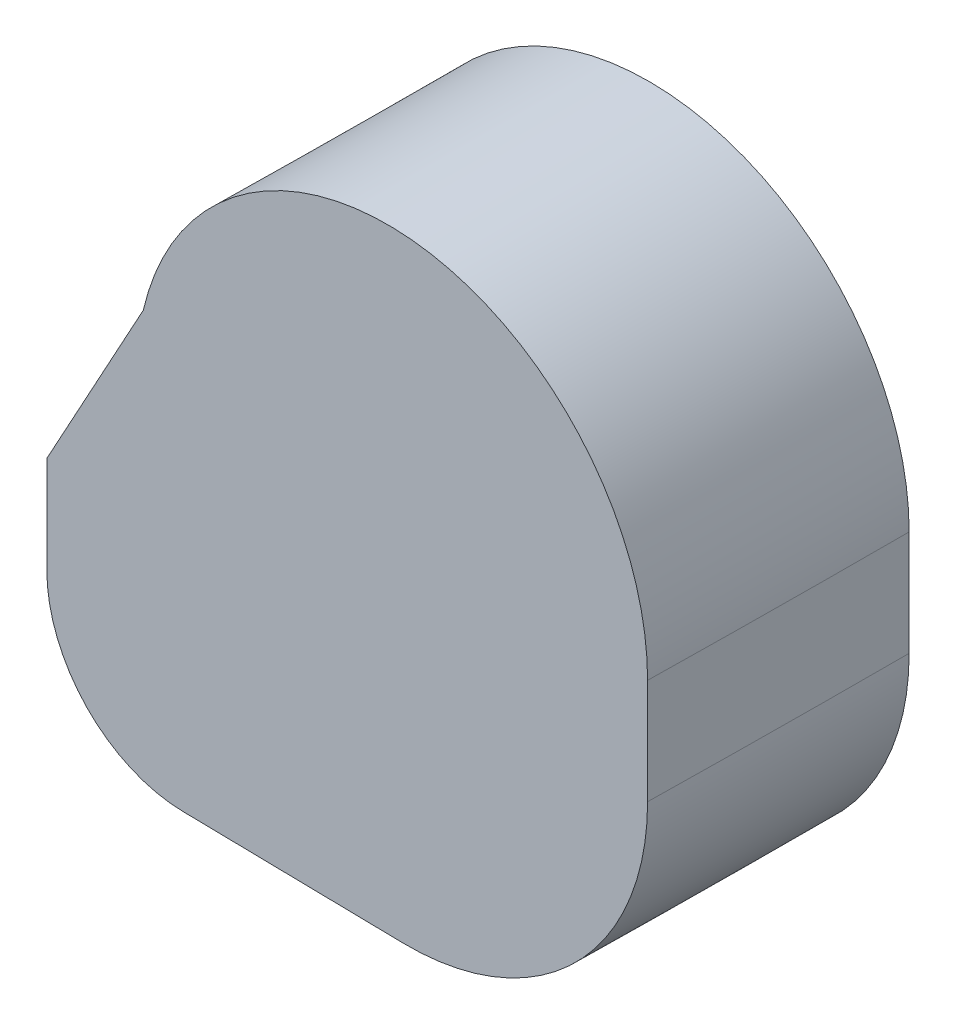
ISO-10303-21;
HEADER;
FILE_DESCRIPTION(('STEP AP214'),'2;1');
FILE_NAME('part.step','',(''),(''),'','','');
FILE_SCHEMA(('AUTOMOTIVE_DESIGN { 1 0 10303 214 1 1 1 1 }'));
ENDSEC;
DATA;
#1=APPLICATION_CONTEXT('core data for automotive mechanical design processes');
#2=APPLICATION_PROTOCOL_DEFINITION('international standard','automotive_design',2000,#1);
#3=PRODUCT_CONTEXT('',#1,'mechanical');
#4=PRODUCT('Part','Part','',(#3));
#5=PRODUCT_RELATED_PRODUCT_CATEGORY('part','',(#4));
#6=PRODUCT_DEFINITION_FORMATION('','',#4);
#7=PRODUCT_DEFINITION_CONTEXT('part definition',#1,'design');
#8=PRODUCT_DEFINITION('design','',#6,#7);
#9=PRODUCT_DEFINITION_SHAPE('','',#8);
#10=(LENGTH_UNIT() NAMED_UNIT(*) SI_UNIT(.MILLI.,.METRE.));
#11=(NAMED_UNIT(*) PLANE_ANGLE_UNIT() SI_UNIT($,.RADIAN.));
#12=(NAMED_UNIT(*) SI_UNIT($,.STERADIAN.) SOLID_ANGLE_UNIT());
#13=UNCERTAINTY_MEASURE_WITH_UNIT(LENGTH_MEASURE(1.E-05),#10,'distance_accuracy_value','');
#14=(GEOMETRIC_REPRESENTATION_CONTEXT(3) GLOBAL_UNCERTAINTY_ASSIGNED_CONTEXT((#13)) GLOBAL_UNIT_ASSIGNED_CONTEXT((#10,
#11,#12)) REPRESENTATION_CONTEXT('',''));
#15=CARTESIAN_POINT('',(0.,0.,0.));
#16=DIRECTION('',(0.,0.,1.));
#17=DIRECTION('',(1.,0.,0.));
#18=AXIS2_PLACEMENT_3D('',#15,#16,#17);
#19=CARTESIAN_POINT('',(-132.03841004,1.27,0.));
#20=DIRECTION('',(0.,1.,0.));
#21=DIRECTION('',(0.,0.,1.));
#22=AXIS2_PLACEMENT_3D('',#19,#20,#21);
#23=TOROIDAL_SURFACE('',#22,132.03841004,1.27);
#24=CARTESIAN_POINT('',(-132.03841004,1.27,0.));
#25=DIRECTION('',(0.,1.,0.));
#26=DIRECTION('',(0.,0.,1.));
#27=AXIS2_PLACEMENT_3D('',#24,#25,#26);
#28=CIRCLE('',#27,130.76841004);
#29=CARTESIAN_POINT('',(-1.2899166622401,1.27,2.28222344117543));
#30=VERTEX_POINT('',#29);
#31=CARTESIAN_POINT('',(-1.27,1.27,0.));
#32=VERTEX_POINT('',#31);
#33=EDGE_CURVE('E11',#30,#32,#28,.T.);
#34=ORIENTED_EDGE('',*,*,#33,.T.);
#35=CARTESIAN_POINT('',(0.,1.27,0.));
#36=DIRECTION('',(0.,0.,1.));
#37=DIRECTION('',(-1.,0.,0.));
#38=AXIS2_PLACEMENT_3D('',#35,#36,#37);
#39=CIRCLE('',#38,1.27);
#40=CARTESIAN_POINT('',(0.,0.,0.));
#41=VERTEX_POINT('',#40);
#42=EDGE_CURVE('E115',#32,#41,#39,.T.);
#43=ORIENTED_EDGE('',*,*,#42,.T.);
#44=CARTESIAN_POINT('',(-132.03841004,0.,0.));
#45=DIRECTION('',(0.,1.,0.));
#46=DIRECTION('',(0.,0.,1.));
#47=AXIS2_PLACEMENT_3D('',#44,#45,#46);
#48=CIRCLE('',#47,132.03841004);
#49=CARTESIAN_POINT('',(-0.0201100893914876,0.,2.30438799735078));
#50=VERTEX_POINT('',#49);
#51=EDGE_CURVE('E97',#50,#41,#48,.T.);
#52=ORIENTED_EDGE('',*,*,#51,.F.);
#53=CARTESIAN_POINT('',(-0.0201100893914876,1.27,2.30438799735078));
#54=DIRECTION('',(-0.0174524064372835,0.,0.999847695156391));
#55=DIRECTION('',(-0.999847695156391,0.,-0.0174524064372835));
#56=AXIS2_PLACEMENT_3D('',#53,#54,#55);
#57=CIRCLE('',#56,1.27);
#58=EDGE_CURVE('E133',#30,#50,#57,.T.);
#59=ORIENTED_EDGE('',*,*,#58,.F.);
#60=EDGE_LOOP('',(#34,#43,#52,#59));
#61=FACE_BOUND('',#60,.T.);
#62=ADVANCED_FACE('F39',(#61),#23,.T.);
#63=CARTESIAN_POINT('',(-132.03841004,8.38450091127262,0.));
#64=DIRECTION('',(0.,1.,0.));
#65=DIRECTION('',(0.,0.,1.));
#66=AXIS2_PLACEMENT_3D('',#63,#64,#65);
#67=CYLINDRICAL_SURFACE('',#66,130.76841004);
#68=CARTESIAN_POINT('',(-132.03841004,2.160242822,0.));
#69=DIRECTION('',(0.,1.,0.));
#70=DIRECTION('',(0.,0.,1.));
#71=AXIS2_PLACEMENT_3D('',#68,#69,#70);
#72=CIRCLE('',#71,130.76841004);
#73=CARTESIAN_POINT('',(-1.2899166622401,2.160242822,2.28222344117543));
#74=VERTEX_POINT('',#73);
#75=CARTESIAN_POINT('',(-1.27,2.160242822,0.));
#76=VERTEX_POINT('',#75);
#77=EDGE_CURVE('E47',#74,#76,#72,.T.);
#78=ORIENTED_EDGE('',*,*,#77,.T.);
#79=DIRECTION('',(0.,-1.,0.));
#80=VECTOR('',#79,1.);
#81=CARTESIAN_POINT('',(-1.27,1.27,0.));
#82=LINE('',#81,#80);
#83=EDGE_CURVE('E131',#76,#32,#82,.T.);
#84=ORIENTED_EDGE('',*,*,#83,.T.);
#85=ORIENTED_EDGE('',*,*,#33,.F.);
#86=DIRECTION('',(0.,-1.,0.));
#87=VECTOR('',#86,1.);
#88=CARTESIAN_POINT('',(-1.2899166622401,1.27,2.28222344117543));
#89=LINE('',#88,#87);
#90=EDGE_CURVE('E109',#74,#30,#89,.T.);
#91=ORIENTED_EDGE('',*,*,#90,.F.);
#92=EDGE_LOOP('',(#78,#84,#85,#91));
#93=FACE_BOUND('',#92,.T.);
#94=ADVANCED_FACE('F41',(#93),#67,.F.);
#95=CARTESIAN_POINT('',(-132.03841004,3.79599359689122,0.));
#96=DIRECTION('',(0.,1.,0.));
#97=DIRECTION('',(0.,0.,1.));
#98=AXIS2_PLACEMENT_3D('',#95,#96,#97);
#99=CONICAL_SURFACE('',#98,131.669595298417,0.50355745042433);
#100=CARTESIAN_POINT('',(-132.03841004,3.79599359689122,0.));
#101=DIRECTION('',(0.,1.,0.));
#102=DIRECTION('',(0.,0.,1.));
#103=AXIS2_PLACEMENT_3D('',#100,#101,#102);
#104=CIRCLE('',#103,131.669595298417);
#105=CARTESIAN_POINT('',(-0.388868658703236,3.79599359689122,2.29795129258061));
#106=VERTEX_POINT('',#105);
#107=CARTESIAN_POINT('',(-0.368814741583286,3.79599359689122,0.));
#108=VERTEX_POINT('',#107);
#109=EDGE_CURVE('E153',#106,#108,#104,.T.);
#110=ORIENTED_EDGE('',*,*,#109,.T.);
#111=DIRECTION('',(-0.48254445480582,-0.875871479805202,0.));
#112=VECTOR('',#111,1.);
#113=CARTESIAN_POINT('',(-0.368814741583286,3.79599359689122,0.));
#114=LINE('',#113,#112);
#115=EDGE_CURVE('E129',#108,#76,#114,.T.);
#116=ORIENTED_EDGE('',*,*,#115,.T.);
#117=ORIENTED_EDGE('',*,*,#77,.F.);
#118=DIRECTION('',(-0.482470960948096,-0.875871479805202,-0.00842156194932857));
#119=VECTOR('',#118,1.);
#120=CARTESIAN_POINT('',(-0.388868658703237,3.79599359689122,2.29795129258061));
#121=LINE('',#120,#119);
#122=EDGE_CURVE('E145',#106,#74,#121,.T.);
#123=ORIENTED_EDGE('',*,*,#122,.F.);
#124=EDGE_LOOP('',(#110,#116,#117,#123));
#125=FACE_BOUND('',#124,.T.);
#126=ADVANCED_FACE('F155',(#125),#99,.F.);
#127=CARTESIAN_POINT('',(-132.03841004,3.2512,0.));
#128=DIRECTION('',(0.,1.,0.));
#129=DIRECTION('',(0.,0.,1.));
#130=AXIS2_PLACEMENT_3D('',#127,#128,#129);
#131=TOROIDAL_SURFACE('',#130,133.99421004,2.3876);
#132=CARTESIAN_POINT('',(-132.03841004,3.2512,0.));
#133=DIRECTION('',(0.,1.,0.));
#134=DIRECTION('',(0.,0.,1.));
#135=AXIS2_PLACEMENT_3D('',#132,#133,#134);
#136=CIRCLE('',#135,136.38181004);
#137=CARTESIAN_POINT('',(4.32262838975078,3.2512,2.38019077947048));
#138=VERTEX_POINT('',#137);
#139=CARTESIAN_POINT('',(4.3434,3.2512,0.));
#140=VERTEX_POINT('',#139);
#141=EDGE_CURVE('E151',#138,#140,#136,.T.);
#142=ORIENTED_EDGE('',*,*,#141,.T.);
#143=CARTESIAN_POINT('',(1.9558,3.2512,0.));
#144=DIRECTION('',(0.,0.,1.));
#145=DIRECTION('',(1.,0.,0.));
#146=AXIS2_PLACEMENT_3D('',#143,#144,#145);
#147=CIRCLE('',#146,2.3876);
#148=EDGE_CURVE('E126',#140,#108,#147,.T.);
#149=ORIENTED_EDGE('',*,*,#148,.T.);
#150=ORIENTED_EDGE('',*,*,#109,.F.);
#151=CARTESIAN_POINT('',(1.93539203279538,3.2512,2.33852141386082));
#152=DIRECTION('',(-0.0174524064372835,0.,0.999847695156391));
#153=DIRECTION('',(0.999847695156391,0.,0.0174524064372835));
#154=AXIS2_PLACEMENT_3D('',#151,#152,#153);
#155=CIRCLE('',#154,2.3876);
#156=EDGE_CURVE('E142',#138,#106,#155,.T.);
#157=ORIENTED_EDGE('',*,*,#156,.F.);
#158=EDGE_LOOP('',(#142,#149,#150,#157));
#159=FACE_BOUND('',#158,.T.);
#160=ADVANCED_FACE('F158',(#159),#131,.T.);
#161=CARTESIAN_POINT('',(-132.03841004,8.38450091127262,0.));
#162=DIRECTION('',(0.,1.,0.));
#163=DIRECTION('',(0.,0.,1.));
#164=AXIS2_PLACEMENT_3D('',#161,#162,#163);
#165=CYLINDRICAL_SURFACE('',#164,136.38181004);
#166=CARTESIAN_POINT('',(-132.03841004,2.28600000000001,0.));
#167=DIRECTION('',(0.,1.,0.));
#168=DIRECTION('',(0.,0.,1.));
#169=AXIS2_PLACEMENT_3D('',#166,#167,#168);
#170=CIRCLE('',#169,136.38181004);
#171=CARTESIAN_POINT('',(4.32262838975078,2.28600000000001,2.38019077947048));
#172=VERTEX_POINT('',#171);
#173=CARTESIAN_POINT('',(4.3434,2.28600000000001,0.));
#174=VERTEX_POINT('',#173);
#175=EDGE_CURVE('E149',#172,#174,#170,.T.);
#176=ORIENTED_EDGE('',*,*,#175,.T.);
#177=DIRECTION('',(0.,1.,0.));
#178=VECTOR('',#177,1.);
#179=CARTESIAN_POINT('',(4.3434,2.28600000000001,0.));
#180=LINE('',#179,#178);
#181=EDGE_CURVE('E123',#174,#140,#180,.T.);
#182=ORIENTED_EDGE('',*,*,#181,.T.);
#183=ORIENTED_EDGE('',*,*,#141,.F.);
#184=DIRECTION('',(0.,1.,0.));
#185=VECTOR('',#184,1.);
#186=CARTESIAN_POINT('',(4.32262838975078,2.28600000000001,2.38019077947048));
#187=LINE('',#186,#185);
#188=EDGE_CURVE('E139',#172,#138,#187,.T.);
#189=ORIENTED_EDGE('',*,*,#188,.F.);
#190=EDGE_LOOP('',(#176,#182,#183,#189));
#191=FACE_BOUND('',#190,.T.);
#192=ADVANCED_FACE('F162',(#191),#165,.T.);
#193=CARTESIAN_POINT('',(-132.03841004,2.286,0.));
#194=DIRECTION('',(0.,1.,0.));
#195=DIRECTION('',(0.,0.,1.));
#196=AXIS2_PLACEMENT_3D('',#193,#194,#195);
#197=TOROIDAL_SURFACE('',#196,134.09581004,2.286);
#198=CARTESIAN_POINT('',(-132.03841004,0.,0.));
#199=DIRECTION('',(0.,1.,0.));
#200=DIRECTION('',(0.,0.,1.));
#201=AXIS2_PLACEMENT_3D('',#198,#199,#200);
#202=CIRCLE('',#201,134.09581004);
#203=CARTESIAN_POINT('',(2.03697655862327,0.,2.34029457835485));
#204=VERTEX_POINT('',#203);
#205=CARTESIAN_POINT('',(2.0574,0.,0.));
#206=VERTEX_POINT('',#205);
#207=EDGE_CURVE('E108',#204,#206,#202,.T.);
#208=ORIENTED_EDGE('',*,*,#207,.T.);
#209=CARTESIAN_POINT('',(2.0574,2.286,0.));
#210=DIRECTION('',(0.,0.,1.));
#211=DIRECTION('',(1.,0.,0.));
#212=AXIS2_PLACEMENT_3D('',#209,#210,#211);
#213=CIRCLE('',#212,2.286);
#214=EDGE_CURVE('E118',#206,#174,#213,.T.);
#215=ORIENTED_EDGE('',*,*,#214,.T.);
#216=ORIENTED_EDGE('',*,*,#175,.F.);
#217=CARTESIAN_POINT('',(2.03697655862327,2.286,2.34029457835485));
#218=DIRECTION('',(-0.0174524064372835,0.,0.999847695156391));
#219=DIRECTION('',(0.999847695156391,0.,0.0174524064372835));
#220=AXIS2_PLACEMENT_3D('',#217,#218,#219);
#221=CIRCLE('',#220,2.286);
#222=EDGE_CURVE('E136',#204,#172,#221,.T.);
#223=ORIENTED_EDGE('',*,*,#222,.F.);
#224=EDGE_LOOP('',(#208,#215,#216,#223));
#225=FACE_BOUND('',#224,.T.);
#226=ADVANCED_FACE('F165',(#225),#197,.T.);
#227=CARTESIAN_POINT('',(-0.0201100893914876,0.,2.30438799735078));
#228=DIRECTION('',(0.,1.,0.));
#229=DIRECTION('',(0.,0.,1.));
#230=AXIS2_PLACEMENT_3D('',#227,#228,#229);
#231=PLANE('',#230);
#232=DIRECTION('',(0.999847695156391,0.,0.0174524064372835));
#233=VECTOR('',#232,1.);
#234=CARTESIAN_POINT('',(-0.0201100893914876,0.,2.30438799735078));
#235=LINE('',#234,#233);
#236=EDGE_CURVE('E103',#50,#204,#235,.T.);
#237=ORIENTED_EDGE('',*,*,#236,.F.);
#238=ORIENTED_EDGE('',*,*,#51,.T.);
#239=DIRECTION('',(1.,0.,0.));
#240=VECTOR('',#239,1.);
#241=CARTESIAN_POINT('',(0.,0.,0.));
#242=LINE('',#241,#240);
#243=EDGE_CURVE('E100',#41,#206,#242,.T.);
#244=ORIENTED_EDGE('',*,*,#243,.T.);
#245=ORIENTED_EDGE('',*,*,#207,.F.);
#246=EDGE_LOOP('',(#237,#238,#244,#245));
#247=FACE_BOUND('',#246,.T.);
#248=ADVANCED_FACE('F99',(#247),#231,.F.);
#249=CARTESIAN_POINT('',(-0.0201100893914876,1.27,2.30438799735078));
#250=DIRECTION('',(0.0174524064372835,0.,-0.999847695156391));
#251=DIRECTION('',(-0.999847695156391,0.,-0.0174524064372835));
#252=AXIS2_PLACEMENT_3D('',#249,#250,#251);
#253=PLANE('',#252);
#254=ORIENTED_EDGE('',*,*,#58,.T.);
#255=ORIENTED_EDGE('',*,*,#236,.T.);
#256=ORIENTED_EDGE('',*,*,#222,.T.);
#257=ORIENTED_EDGE('',*,*,#188,.T.);
#258=ORIENTED_EDGE('',*,*,#156,.T.);
#259=ORIENTED_EDGE('',*,*,#122,.T.);
#260=ORIENTED_EDGE('',*,*,#90,.T.);
#261=EDGE_LOOP('',(#254,#255,#256,#257,#258,#259,#260));
#262=FACE_BOUND('',#261,.T.);
#263=ADVANCED_FACE('F167',(#262),#253,.F.);
#264=CARTESIAN_POINT('',(0.,1.27,0.));
#265=DIRECTION('',(0.,0.,-1.));
#266=DIRECTION('',(-1.,0.,0.));
#267=AXIS2_PLACEMENT_3D('',#264,#265,#266);
#268=PLANE('',#267);
#269=ORIENTED_EDGE('',*,*,#42,.F.);
#270=ORIENTED_EDGE('',*,*,#83,.F.);
#271=ORIENTED_EDGE('',*,*,#115,.F.);
#272=ORIENTED_EDGE('',*,*,#148,.F.);
#273=ORIENTED_EDGE('',*,*,#181,.F.);
#274=ORIENTED_EDGE('',*,*,#214,.F.);
#275=ORIENTED_EDGE('',*,*,#243,.F.);
#276=EDGE_LOOP('',(#269,#270,#271,#272,#273,#274,#275));
#277=FACE_BOUND('',#276,.T.);
#278=ADVANCED_FACE('F113',(#277),#268,.T.);
#279=CLOSED_SHELL('',(#62,#94,#126,#160,#192,#226,#248,#263,#278));
#280=MANIFOLD_SOLID_BREP('B2',#279);
#281=ADVANCED_BREP_SHAPE_REPRESENTATION('',(#18,#280),#14);
#282=SHAPE_DEFINITION_REPRESENTATION(#9,#281);
ENDSEC;
END-ISO-10303-21;
